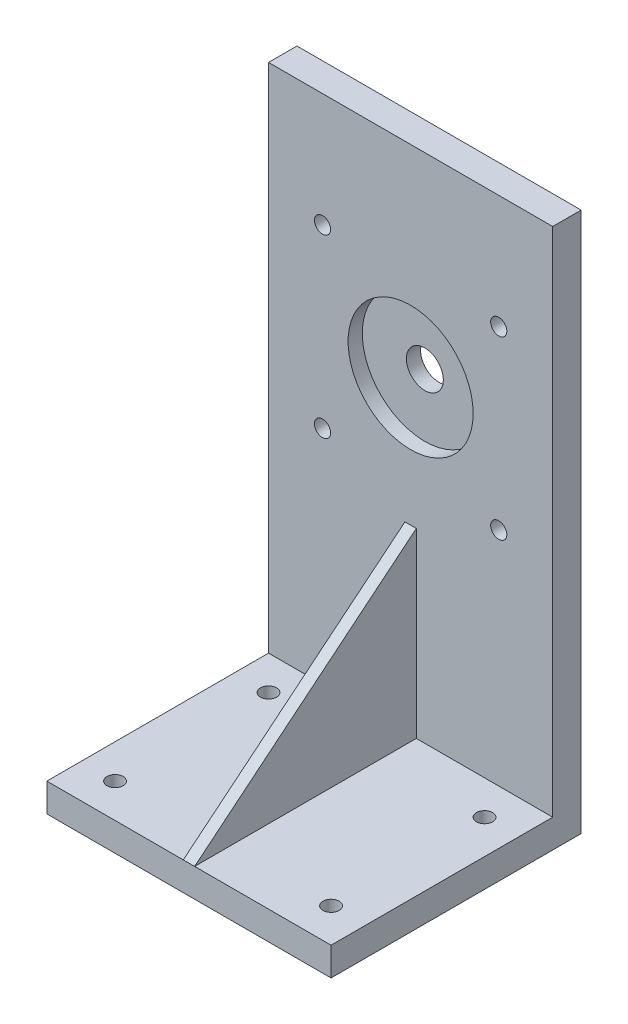
ISO-10303-21;
HEADER;
FILE_DESCRIPTION(('STEP AP214'),'2;1');
FILE_NAME('part.step','',(''),(''),'','','');
FILE_SCHEMA(('AUTOMOTIVE_DESIGN { 1 0 10303 214 1 1 1 1 }'));
ENDSEC;
DATA;
#1=APPLICATION_CONTEXT('core data for automotive mechanical design processes');
#2=APPLICATION_PROTOCOL_DEFINITION('international standard','automotive_design',2000,#1);
#3=PRODUCT_CONTEXT('',#1,'mechanical');
#4=PRODUCT('Part','Part','',(#3));
#5=PRODUCT_RELATED_PRODUCT_CATEGORY('part','',(#4));
#6=PRODUCT_DEFINITION_FORMATION('','',#4);
#7=PRODUCT_DEFINITION_CONTEXT('part definition',#1,'design');
#8=PRODUCT_DEFINITION('design','',#6,#7);
#9=PRODUCT_DEFINITION_SHAPE('','',#8);
#10=(LENGTH_UNIT() NAMED_UNIT(*) SI_UNIT(.MILLI.,.METRE.));
#11=(NAMED_UNIT(*) PLANE_ANGLE_UNIT() SI_UNIT($,.RADIAN.));
#12=(NAMED_UNIT(*) SI_UNIT($,.STERADIAN.) SOLID_ANGLE_UNIT());
#13=UNCERTAINTY_MEASURE_WITH_UNIT(LENGTH_MEASURE(1.E-05),#10,'distance_accuracy_value','');
#14=(GEOMETRIC_REPRESENTATION_CONTEXT(3) GLOBAL_UNCERTAINTY_ASSIGNED_CONTEXT((#13)) GLOBAL_UNIT_ASSIGNED_CONTEXT((#10,
#11,#12)) REPRESENTATION_CONTEXT('',''));
#15=CARTESIAN_POINT('',(0.,0.,0.));
#16=DIRECTION('',(0.,0.,1.));
#17=DIRECTION('',(1.,0.,0.));
#18=AXIS2_PLACEMENT_3D('',#15,#16,#17);
#19=CARTESIAN_POINT('',(0.,5.,0.));
#20=DIRECTION('',(0.,-1.,0.));
#21=DIRECTION('',(0.,0.,-1.));
#22=AXIS2_PLACEMENT_3D('',#19,#20,#21);
#23=PLANE('',#22);
#24=CARTESIAN_POINT('',(19.,5.,-11.));
#25=DIRECTION('',(0.,1.,0.));
#26=DIRECTION('',(0.,0.,1.));
#27=AXIS2_PLACEMENT_3D('',#24,#25,#26);
#28=CIRCLE('',#27,1.42);
#29=CARTESIAN_POINT('',(19.,5.,-9.57999999999999));
#30=VERTEX_POINT('',#29);
#31=EDGE_CURVE('E176',#30,#30,#28,.T.);
#32=ORIENTED_EDGE('',*,*,#31,.F.);
#33=EDGE_LOOP('',(#32));
#34=FACE_BOUND('',#33,.T.);
#35=CARTESIAN_POINT('',(19.,5.,16.));
#36=DIRECTION('',(0.,1.,0.));
#37=DIRECTION('',(0.,0.,1.));
#38=AXIS2_PLACEMENT_3D('',#35,#36,#37);
#39=CIRCLE('',#38,1.42);
#40=CARTESIAN_POINT('',(19.,5.,17.42));
#41=VERTEX_POINT('',#40);
#42=EDGE_CURVE('E260',#41,#41,#39,.T.);
#43=ORIENTED_EDGE('',*,*,#42,.F.);
#44=EDGE_LOOP('',(#43));
#45=FACE_BOUND('',#44,.T.);
#46=DIRECTION('',(0.,0.,-1.));
#47=VECTOR('',#46,1.);
#48=CARTESIAN_POINT('',(0.999999999999997,5.,-17.));
#49=LINE('',#48,#47);
#50=CARTESIAN_POINT('',(1.,5.,22.));
#51=VERTEX_POINT('',#50);
#52=CARTESIAN_POINT('',(1.,5.,-17.));
#53=VERTEX_POINT('',#52);
#54=EDGE_CURVE('E119',#51,#53,#49,.T.);
#55=ORIENTED_EDGE('',*,*,#54,.F.);
#56=DIRECTION('',(1.,0.,0.));
#57=VECTOR('',#56,1.);
#58=CARTESIAN_POINT('',(-25.,5.,22.));
#59=LINE('',#58,#57);
#60=CARTESIAN_POINT('',(25.,5.,22.));
#61=VERTEX_POINT('',#60);
#62=EDGE_CURVE('E123',#51,#61,#59,.T.);
#63=ORIENTED_EDGE('',*,*,#62,.T.);
#64=DIRECTION('',(0.,0.,-1.));
#65=VECTOR('',#64,1.);
#66=CARTESIAN_POINT('',(25.,5.,22.));
#67=LINE('',#66,#65);
#68=CARTESIAN_POINT('',(25.,5.,-17.));
#69=VERTEX_POINT('',#68);
#70=EDGE_CURVE('E135',#61,#69,#67,.T.);
#71=ORIENTED_EDGE('',*,*,#70,.T.);
#72=DIRECTION('',(1.,0.,0.));
#73=VECTOR('',#72,1.);
#74=CARTESIAN_POINT('',(-25.,5.,-17.));
#75=LINE('',#74,#73);
#76=EDGE_CURVE('E125',#53,#69,#75,.T.);
#77=ORIENTED_EDGE('',*,*,#76,.F.);
#78=EDGE_LOOP('',(#55,#63,#71,#77));
#79=FACE_BOUND('',#78,.T.);
#80=ADVANCED_FACE('F35',(#34,#45,#79),#23,.F.);
#81=CARTESIAN_POINT('',(-19.,5.,-11.));
#82=DIRECTION('',(0.,1.,0.));
#83=DIRECTION('',(0.,0.,1.));
#84=AXIS2_PLACEMENT_3D('',#81,#82,#83);
#85=CIRCLE('',#84,1.42);
#86=CARTESIAN_POINT('',(-19.,5.,-9.57999999999999));
#87=VERTEX_POINT('',#86);
#88=EDGE_CURVE('E159',#87,#87,#85,.T.);
#89=ORIENTED_EDGE('',*,*,#88,.F.);
#90=EDGE_LOOP('',(#89));
#91=FACE_BOUND('',#90,.T.);
#92=CARTESIAN_POINT('',(-19.,5.,16.));
#93=DIRECTION('',(0.,1.,0.));
#94=DIRECTION('',(0.,0.,1.));
#95=AXIS2_PLACEMENT_3D('',#92,#93,#94);
#96=CIRCLE('',#95,1.42);
#97=CARTESIAN_POINT('',(-19.,5.,17.42));
#98=VERTEX_POINT('',#97);
#99=EDGE_CURVE('E163',#98,#98,#96,.T.);
#100=ORIENTED_EDGE('',*,*,#99,.F.);
#101=EDGE_LOOP('',(#100));
#102=FACE_BOUND('',#101,.T.);
#103=DIRECTION('',(0.,0.,1.));
#104=VECTOR('',#103,1.);
#105=CARTESIAN_POINT('',(-0.999999999999997,5.,-17.));
#106=LINE('',#105,#104);
#107=CARTESIAN_POINT('',(-0.999999999999994,5.,-17.));
#108=VERTEX_POINT('',#107);
#109=CARTESIAN_POINT('',(-0.999999999999994,5.,22.));
#110=VERTEX_POINT('',#109);
#111=EDGE_CURVE('E126',#108,#110,#106,.T.);
#112=ORIENTED_EDGE('',*,*,#111,.F.);
#113=CARTESIAN_POINT('',(-25.,5.,-17.));
#114=VERTEX_POINT('',#113);
#115=EDGE_CURVE('E217',#114,#108,#75,.T.);
#116=ORIENTED_EDGE('',*,*,#115,.F.);
#117=DIRECTION('',(0.,0.,1.));
#118=VECTOR('',#117,1.);
#119=CARTESIAN_POINT('',(-25.,5.,22.));
#120=LINE('',#119,#118);
#121=CARTESIAN_POINT('',(-25.,5.,22.));
#122=VERTEX_POINT('',#121);
#123=EDGE_CURVE('E133',#114,#122,#120,.T.);
#124=ORIENTED_EDGE('',*,*,#123,.T.);
#125=EDGE_CURVE('E132',#122,#110,#59,.T.);
#126=ORIENTED_EDGE('',*,*,#125,.T.);
#127=EDGE_LOOP('',(#112,#116,#124,#126));
#128=FACE_BOUND('',#127,.T.);
#129=ADVANCED_FACE('F247',(#91,#102,#128),#23,.F.);
#130=CARTESIAN_POINT('',(-25.,95.,-17.));
#131=DIRECTION('',(0.,0.,-1.));
#132=DIRECTION('',(-1.,0.,0.));
#133=AXIS2_PLACEMENT_3D('',#130,#131,#132);
#134=PLANE('',#133);
#135=DIRECTION('',(0.,-1.,0.));
#136=VECTOR('',#135,1.);
#137=CARTESIAN_POINT('',(-0.999999999999997,37.,-17.));
#138=LINE('',#137,#136);
#139=CARTESIAN_POINT('',(-0.999999999999994,37.,-17.));
#140=VERTEX_POINT('',#139);
#141=EDGE_CURVE('E250',#140,#108,#138,.T.);
#142=ORIENTED_EDGE('',*,*,#141,.F.);
#143=DIRECTION('',(-1.,0.,0.));
#144=VECTOR('',#143,1.);
#145=CARTESIAN_POINT('',(0.999999999999997,37.,-17.));
#146=LINE('',#145,#144);
#147=CARTESIAN_POINT('',(1.,37.,-17.));
#148=VERTEX_POINT('',#147);
#149=EDGE_CURVE('E253',#148,#140,#146,.T.);
#150=ORIENTED_EDGE('',*,*,#149,.F.);
#151=DIRECTION('',(0.,-1.,0.));
#152=VECTOR('',#151,1.);
#153=CARTESIAN_POINT('',(0.999999999999997,37.,-17.));
#154=LINE('',#153,#152);
#155=EDGE_CURVE('E59',#148,#53,#154,.T.);
#156=ORIENTED_EDGE('',*,*,#155,.T.);
#157=ORIENTED_EDGE('',*,*,#76,.T.);
#158=DIRECTION('',(0.,-1.,0.));
#159=VECTOR('',#158,1.);
#160=CARTESIAN_POINT('',(25.,95.,-17.));
#161=LINE('',#160,#159);
#162=CARTESIAN_POINT('',(25.,95.,-17.));
#163=VERTEX_POINT('',#162);
#164=EDGE_CURVE('E225',#163,#69,#161,.T.);
#165=ORIENTED_EDGE('',*,*,#164,.F.);
#166=DIRECTION('',(1.,0.,0.));
#167=VECTOR('',#166,1.);
#168=CARTESIAN_POINT('',(-25.,95.,-17.));
#169=LINE('',#168,#167);
#170=CARTESIAN_POINT('',(-25.,95.,-17.));
#171=VERTEX_POINT('',#170);
#172=EDGE_CURVE('E216',#171,#163,#169,.T.);
#173=ORIENTED_EDGE('',*,*,#172,.F.);
#174=DIRECTION('',(0.,-1.,0.));
#175=VECTOR('',#174,1.);
#176=CARTESIAN_POINT('',(-25.,95.,-17.));
#177=LINE('',#176,#175);
#178=EDGE_CURVE('E143',#171,#114,#177,.T.);
#179=ORIENTED_EDGE('',*,*,#178,.T.);
#180=ORIENTED_EDGE('',*,*,#115,.T.);
#181=EDGE_LOOP('',(#142,#150,#156,#157,#165,#173,#179,#180));
#182=FACE_BOUND('',#181,.T.);
#183=CARTESIAN_POINT('',(0.,59.5,-17.));
#184=DIRECTION('',(0.,0.,1.));
#185=DIRECTION('',(1.,0.,0.));
#186=AXIS2_PLACEMENT_3D('',#183,#184,#185);
#187=CIRCLE('',#186,11.);
#188=CARTESIAN_POINT('',(11.,59.5,-17.));
#189=VERTEX_POINT('',#188);
#190=EDGE_CURVE('E183',#189,#189,#187,.T.);
#191=ORIENTED_EDGE('',*,*,#190,.F.);
#192=EDGE_LOOP('',(#191));
#193=FACE_BOUND('',#192,.T.);
#194=CARTESIAN_POINT('',(15.5,44.,-17.));
#195=DIRECTION('',(0.,0.,1.));
#196=DIRECTION('',(1.,0.,0.));
#197=AXIS2_PLACEMENT_3D('',#194,#195,#196);
#198=CIRCLE('',#197,1.42);
#199=CARTESIAN_POINT('',(16.92,44.,-17.));
#200=VERTEX_POINT('',#199);
#201=EDGE_CURVE('E190',#200,#200,#198,.T.);
#202=ORIENTED_EDGE('',*,*,#201,.F.);
#203=EDGE_LOOP('',(#202));
#204=FACE_BOUND('',#203,.T.);
#205=CARTESIAN_POINT('',(15.4999999999999,75.,-17.));
#206=DIRECTION('',(0.,0.,1.));
#207=DIRECTION('',(1.,0.,0.));
#208=AXIS2_PLACEMENT_3D('',#205,#206,#207);
#209=CIRCLE('',#208,1.41999999999999);
#210=CARTESIAN_POINT('',(16.9199999999999,75.,-17.));
#211=VERTEX_POINT('',#210);
#212=EDGE_CURVE('E194',#211,#211,#209,.T.);
#213=ORIENTED_EDGE('',*,*,#212,.F.);
#214=EDGE_LOOP('',(#213));
#215=FACE_BOUND('',#214,.T.);
#216=CARTESIAN_POINT('',(-15.5000000000001,75.,-17.));
#217=DIRECTION('',(0.,0.,1.));
#218=DIRECTION('',(1.,0.,0.));
#219=AXIS2_PLACEMENT_3D('',#216,#217,#218);
#220=CIRCLE('',#219,1.42);
#221=CARTESIAN_POINT('',(-14.0800000000001,75.,-17.));
#222=VERTEX_POINT('',#221);
#223=EDGE_CURVE('E187',#222,#222,#220,.T.);
#224=ORIENTED_EDGE('',*,*,#223,.F.);
#225=EDGE_LOOP('',(#224));
#226=FACE_BOUND('',#225,.T.);
#227=CARTESIAN_POINT('',(-15.5,44.,-17.));
#228=DIRECTION('',(0.,0.,1.));
#229=DIRECTION('',(1.,0.,0.));
#230=AXIS2_PLACEMENT_3D('',#227,#228,#229);
#231=CIRCLE('',#230,1.42);
#232=CARTESIAN_POINT('',(-14.08,44.,-17.));
#233=VERTEX_POINT('',#232);
#234=EDGE_CURVE('E207',#233,#233,#231,.T.);
#235=ORIENTED_EDGE('',*,*,#234,.F.);
#236=EDGE_LOOP('',(#235));
#237=FACE_BOUND('',#236,.T.);
#238=ADVANCED_FACE('F234',(#182,#193,#204,#215,#226,#237),#134,.F.);
#239=CARTESIAN_POINT('',(25.,5.,22.));
#240=DIRECTION('',(-1.,0.,0.));
#241=DIRECTION('',(0.,0.,1.));
#242=AXIS2_PLACEMENT_3D('',#239,#240,#241);
#243=PLANE('',#242);
#244=DIRECTION('',(0.,0.,-1.));
#245=VECTOR('',#244,1.);
#246=CARTESIAN_POINT('',(25.,0.,22.));
#247=LINE('',#246,#245);
#248=CARTESIAN_POINT('',(25.,0.,22.));
#249=VERTEX_POINT('',#248);
#250=CARTESIAN_POINT('',(25.,0.,-22.));
#251=VERTEX_POINT('',#250);
#252=EDGE_CURVE('E139',#249,#251,#247,.T.);
#253=ORIENTED_EDGE('',*,*,#252,.T.);
#254=DIRECTION('',(0.,-1.,0.));
#255=VECTOR('',#254,1.);
#256=CARTESIAN_POINT('',(25.,5.,-22.));
#257=LINE('',#256,#255);
#258=CARTESIAN_POINT('',(25.,95.,-22.));
#259=VERTEX_POINT('',#258);
#260=EDGE_CURVE('E11',#259,#251,#257,.T.);
#261=ORIENTED_EDGE('',*,*,#260,.F.);
#262=DIRECTION('',(0.,0.,-1.));
#263=VECTOR('',#262,1.);
#264=CARTESIAN_POINT('',(25.,95.,-22.));
#265=LINE('',#264,#263);
#266=EDGE_CURVE('E219',#163,#259,#265,.T.);
#267=ORIENTED_EDGE('',*,*,#266,.F.);
#268=ORIENTED_EDGE('',*,*,#164,.T.);
#269=ORIENTED_EDGE('',*,*,#70,.F.);
#270=DIRECTION('',(0.,-1.,0.));
#271=VECTOR('',#270,1.);
#272=CARTESIAN_POINT('',(25.,5.,22.));
#273=LINE('',#272,#271);
#274=EDGE_CURVE('E130',#61,#249,#273,.T.);
#275=ORIENTED_EDGE('',*,*,#274,.T.);
#276=EDGE_LOOP('',(#253,#261,#267,#268,#269,#275));
#277=FACE_BOUND('',#276,.T.);
#278=ADVANCED_FACE('F37',(#277),#243,.F.);
#279=CARTESIAN_POINT('',(-25.,5.,-22.));
#280=DIRECTION('',(0.,0.,1.));
#281=DIRECTION('',(1.,0.,0.));
#282=AXIS2_PLACEMENT_3D('',#279,#280,#281);
#283=PLANE('',#282);
#284=CARTESIAN_POINT('',(0.,59.5,-22.));
#285=DIRECTION('',(0.,0.,1.));
#286=DIRECTION('',(1.,0.,0.));
#287=AXIS2_PLACEMENT_3D('',#284,#285,#286);
#288=CIRCLE('',#287,3.25);
#289=CARTESIAN_POINT('',(3.25,59.5,-22.));
#290=VERTEX_POINT('',#289);
#291=EDGE_CURVE('E180',#290,#290,#288,.T.);
#292=ORIENTED_EDGE('',*,*,#291,.T.);
#293=EDGE_LOOP('',(#292));
#294=FACE_BOUND('',#293,.T.);
#295=CARTESIAN_POINT('',(15.5,44.,-22.));
#296=DIRECTION('',(0.,0.,1.));
#297=DIRECTION('',(1.,0.,0.));
#298=AXIS2_PLACEMENT_3D('',#295,#296,#297);
#299=CIRCLE('',#298,1.42);
#300=CARTESIAN_POINT('',(16.92,44.,-22.));
#301=VERTEX_POINT('',#300);
#302=EDGE_CURVE('E204',#301,#301,#299,.T.);
#303=ORIENTED_EDGE('',*,*,#302,.T.);
#304=EDGE_LOOP('',(#303));
#305=FACE_BOUND('',#304,.T.);
#306=CARTESIAN_POINT('',(15.4999999999999,75.,-22.));
#307=DIRECTION('',(0.,0.,1.));
#308=DIRECTION('',(1.,0.,0.));
#309=AXIS2_PLACEMENT_3D('',#306,#307,#308);
#310=CIRCLE('',#309,1.41999999999999);
#311=CARTESIAN_POINT('',(16.9199999999999,75.,-22.));
#312=VERTEX_POINT('',#311);
#313=EDGE_CURVE('E201',#312,#312,#310,.T.);
#314=ORIENTED_EDGE('',*,*,#313,.T.);
#315=EDGE_LOOP('',(#314));
#316=FACE_BOUND('',#315,.T.);
#317=CARTESIAN_POINT('',(-15.5000000000001,75.,-22.));
#318=DIRECTION('',(0.,0.,1.));
#319=DIRECTION('',(1.,0.,0.));
#320=AXIS2_PLACEMENT_3D('',#317,#318,#319);
#321=CIRCLE('',#320,1.42);
#322=CARTESIAN_POINT('',(-14.0800000000001,75.,-22.));
#323=VERTEX_POINT('',#322);
#324=EDGE_CURVE('E193',#323,#323,#321,.T.);
#325=ORIENTED_EDGE('',*,*,#324,.T.);
#326=EDGE_LOOP('',(#325));
#327=FACE_BOUND('',#326,.T.);
#328=CARTESIAN_POINT('',(-15.5,44.,-22.));
#329=DIRECTION('',(0.,0.,1.));
#330=DIRECTION('',(1.,0.,0.));
#331=AXIS2_PLACEMENT_3D('',#328,#329,#330);
#332=CIRCLE('',#331,1.42);
#333=CARTESIAN_POINT('',(-14.08,44.,-22.));
#334=VERTEX_POINT('',#333);
#335=EDGE_CURVE('E210',#334,#334,#332,.T.);
#336=ORIENTED_EDGE('',*,*,#335,.T.);
#337=EDGE_LOOP('',(#336));
#338=FACE_BOUND('',#337,.T.);
#339=DIRECTION('',(-1.,0.,0.));
#340=VECTOR('',#339,1.);
#341=CARTESIAN_POINT('',(-25.,0.,-22.));
#342=LINE('',#341,#340);
#343=CARTESIAN_POINT('',(-25.,0.,-22.));
#344=VERTEX_POINT('',#343);
#345=EDGE_CURVE('E142',#251,#344,#342,.T.);
#346=ORIENTED_EDGE('',*,*,#345,.T.);
#347=DIRECTION('',(0.,-1.,0.));
#348=VECTOR('',#347,1.);
#349=CARTESIAN_POINT('',(-25.,5.,-22.));
#350=LINE('',#349,#348);
#351=CARTESIAN_POINT('',(-25.,95.,-22.));
#352=VERTEX_POINT('',#351);
#353=EDGE_CURVE('E44',#352,#344,#350,.T.);
#354=ORIENTED_EDGE('',*,*,#353,.F.);
#355=DIRECTION('',(-1.,0.,0.));
#356=VECTOR('',#355,1.);
#357=CARTESIAN_POINT('',(-25.,95.,-22.));
#358=LINE('',#357,#356);
#359=EDGE_CURVE('E222',#259,#352,#358,.T.);
#360=ORIENTED_EDGE('',*,*,#359,.F.);
#361=ORIENTED_EDGE('',*,*,#260,.T.);
#362=EDGE_LOOP('',(#346,#354,#360,#361));
#363=FACE_BOUND('',#362,.T.);
#364=ADVANCED_FACE('F286',(#294,#305,#316,#327,#338,#363),#283,.F.);
#365=CARTESIAN_POINT('',(-25.,5.,22.));
#366=DIRECTION('',(1.,0.,0.));
#367=DIRECTION('',(0.,0.,-1.));
#368=AXIS2_PLACEMENT_3D('',#365,#366,#367);
#369=PLANE('',#368);
#370=DIRECTION('',(0.,0.,1.));
#371=VECTOR('',#370,1.);
#372=CARTESIAN_POINT('',(-25.,0.,22.));
#373=LINE('',#372,#371);
#374=CARTESIAN_POINT('',(-25.,0.,22.));
#375=VERTEX_POINT('',#374);
#376=EDGE_CURVE('E145',#344,#375,#373,.T.);
#377=ORIENTED_EDGE('',*,*,#376,.T.);
#378=DIRECTION('',(0.,-1.,0.));
#379=VECTOR('',#378,1.);
#380=CARTESIAN_POINT('',(-25.,5.,22.));
#381=LINE('',#380,#379);
#382=EDGE_CURVE('E150',#122,#375,#381,.T.);
#383=ORIENTED_EDGE('',*,*,#382,.F.);
#384=ORIENTED_EDGE('',*,*,#123,.F.);
#385=ORIENTED_EDGE('',*,*,#178,.F.);
#386=DIRECTION('',(0.,0.,1.));
#387=VECTOR('',#386,1.);
#388=CARTESIAN_POINT('',(-25.,95.,-22.));
#389=LINE('',#388,#387);
#390=EDGE_CURVE('E213',#352,#171,#389,.T.);
#391=ORIENTED_EDGE('',*,*,#390,.F.);
#392=ORIENTED_EDGE('',*,*,#353,.T.);
#393=EDGE_LOOP('',(#377,#383,#384,#385,#391,#392));
#394=FACE_BOUND('',#393,.T.);
#395=ADVANCED_FACE('F244',(#394),#369,.F.);
#396=CARTESIAN_POINT('',(-25.,5.,22.));
#397=DIRECTION('',(0.,0.,-1.));
#398=DIRECTION('',(-1.,0.,0.));
#399=AXIS2_PLACEMENT_3D('',#396,#397,#398);
#400=PLANE('',#399);
#401=ORIENTED_EDGE('',*,*,#62,.F.);
#402=DIRECTION('',(1.,0.,0.));
#403=VECTOR('',#402,1.);
#404=CARTESIAN_POINT('',(-34.,5.,22.));
#405=LINE('',#404,#403);
#406=EDGE_CURVE('E106',#110,#51,#405,.T.);
#407=ORIENTED_EDGE('',*,*,#406,.F.);
#408=ORIENTED_EDGE('',*,*,#125,.F.);
#409=ORIENTED_EDGE('',*,*,#382,.T.);
#410=DIRECTION('',(1.,0.,0.));
#411=VECTOR('',#410,1.);
#412=CARTESIAN_POINT('',(-25.,0.,22.));
#413=LINE('',#412,#411);
#414=EDGE_CURVE('E147',#375,#249,#413,.T.);
#415=ORIENTED_EDGE('',*,*,#414,.T.);
#416=ORIENTED_EDGE('',*,*,#274,.F.);
#417=EDGE_LOOP('',(#401,#407,#408,#409,#415,#416));
#418=FACE_BOUND('',#417,.T.);
#419=ADVANCED_FACE('F128',(#418),#400,.F.);
#420=CARTESIAN_POINT('',(0.,0.,0.));
#421=DIRECTION('',(0.,-1.,0.));
#422=DIRECTION('',(0.,0.,-1.));
#423=AXIS2_PLACEMENT_3D('',#420,#421,#422);
#424=PLANE('',#423);
#425=CARTESIAN_POINT('',(-19.,0.,16.));
#426=DIRECTION('',(0.,-1.,0.));
#427=DIRECTION('',(0.,0.,-1.));
#428=AXIS2_PLACEMENT_3D('',#425,#426,#427);
#429=CIRCLE('',#428,1.42);
#430=CARTESIAN_POINT('',(-19.,0.,14.58));
#431=VERTEX_POINT('',#430);
#432=EDGE_CURVE('E39',#431,#431,#429,.T.);
#433=ORIENTED_EDGE('',*,*,#432,.F.);
#434=EDGE_LOOP('',(#433));
#435=FACE_BOUND('',#434,.T.);
#436=CARTESIAN_POINT('',(19.,0.,16.));
#437=DIRECTION('',(0.,-1.,0.));
#438=DIRECTION('',(0.,0.,-1.));
#439=AXIS2_PLACEMENT_3D('',#436,#437,#438);
#440=CIRCLE('',#439,1.42);
#441=CARTESIAN_POINT('',(19.,0.,14.58));
#442=VERTEX_POINT('',#441);
#443=EDGE_CURVE('E162',#442,#442,#440,.T.);
#444=ORIENTED_EDGE('',*,*,#443,.F.);
#445=EDGE_LOOP('',(#444));
#446=FACE_BOUND('',#445,.T.);
#447=CARTESIAN_POINT('',(19.,0.,-11.));
#448=DIRECTION('',(0.,-1.,0.));
#449=DIRECTION('',(0.,0.,-1.));
#450=AXIS2_PLACEMENT_3D('',#447,#448,#449);
#451=CIRCLE('',#450,1.42);
#452=CARTESIAN_POINT('',(19.,0.,-12.42));
#453=VERTEX_POINT('',#452);
#454=EDGE_CURVE('E160',#453,#453,#451,.T.);
#455=ORIENTED_EDGE('',*,*,#454,.F.);
#456=EDGE_LOOP('',(#455));
#457=FACE_BOUND('',#456,.T.);
#458=CARTESIAN_POINT('',(-19.,0.,-11.));
#459=DIRECTION('',(0.,-1.,0.));
#460=DIRECTION('',(0.,0.,-1.));
#461=AXIS2_PLACEMENT_3D('',#458,#459,#460);
#462=CIRCLE('',#461,1.42);
#463=CARTESIAN_POINT('',(-19.,0.,-12.42));
#464=VERTEX_POINT('',#463);
#465=EDGE_CURVE('E155',#464,#464,#462,.T.);
#466=ORIENTED_EDGE('',*,*,#465,.F.);
#467=EDGE_LOOP('',(#466));
#468=FACE_BOUND('',#467,.T.);
#469=ORIENTED_EDGE('',*,*,#252,.F.);
#470=ORIENTED_EDGE('',*,*,#414,.F.);
#471=ORIENTED_EDGE('',*,*,#376,.F.);
#472=ORIENTED_EDGE('',*,*,#345,.F.);
#473=EDGE_LOOP('',(#469,#470,#471,#472));
#474=FACE_BOUND('',#473,.T.);
#475=ADVANCED_FACE('F279',(#435,#446,#457,#468,#474),#424,.T.);
#476=CARTESIAN_POINT('',(0.,95.,0.));
#477=DIRECTION('',(0.,1.,0.));
#478=DIRECTION('',(0.,0.,1.));
#479=AXIS2_PLACEMENT_3D('',#476,#477,#478);
#480=PLANE('',#479);
#481=ORIENTED_EDGE('',*,*,#390,.T.);
#482=ORIENTED_EDGE('',*,*,#172,.T.);
#483=ORIENTED_EDGE('',*,*,#266,.T.);
#484=ORIENTED_EDGE('',*,*,#359,.T.);
#485=EDGE_LOOP('',(#481,#482,#483,#484));
#486=FACE_BOUND('',#485,.T.);
#487=ADVANCED_FACE('F240',(#486),#480,.T.);
#488=CARTESIAN_POINT('',(-15.5,44.,-77.));
#489=DIRECTION('',(0.,0.,1.));
#490=DIRECTION('',(1.,0.,0.));
#491=AXIS2_PLACEMENT_3D('',#488,#489,#490);
#492=CYLINDRICAL_SURFACE('',#491,1.42);
#493=ORIENTED_EDGE('',*,*,#234,.T.);
#494=EDGE_LOOP('',(#493));
#495=FACE_BOUND('',#494,.T.);
#496=ORIENTED_EDGE('',*,*,#335,.F.);
#497=EDGE_LOOP('',(#496));
#498=FACE_BOUND('',#497,.T.);
#499=ADVANCED_FACE('F307',(#495,#498),#492,.F.);
#500=CARTESIAN_POINT('',(-15.5000000000001,75.,-77.));
#501=DIRECTION('',(0.,0.,1.));
#502=DIRECTION('',(1.,0.,0.));
#503=AXIS2_PLACEMENT_3D('',#500,#501,#502);
#504=CYLINDRICAL_SURFACE('',#503,1.42);
#505=ORIENTED_EDGE('',*,*,#223,.T.);
#506=EDGE_LOOP('',(#505));
#507=FACE_BOUND('',#506,.T.);
#508=ORIENTED_EDGE('',*,*,#324,.F.);
#509=EDGE_LOOP('',(#508));
#510=FACE_BOUND('',#509,.T.);
#511=ADVANCED_FACE('F309',(#507,#510),#504,.F.);
#512=CARTESIAN_POINT('',(15.4999999999999,75.,-77.));
#513=DIRECTION('',(0.,0.,1.));
#514=DIRECTION('',(1.,0.,0.));
#515=AXIS2_PLACEMENT_3D('',#512,#513,#514);
#516=CYLINDRICAL_SURFACE('',#515,1.41999999999999);
#517=ORIENTED_EDGE('',*,*,#212,.T.);
#518=EDGE_LOOP('',(#517));
#519=FACE_BOUND('',#518,.T.);
#520=ORIENTED_EDGE('',*,*,#313,.F.);
#521=EDGE_LOOP('',(#520));
#522=FACE_BOUND('',#521,.T.);
#523=ADVANCED_FACE('F316',(#519,#522),#516,.F.);
#524=CARTESIAN_POINT('',(15.5,44.,-77.));
#525=DIRECTION('',(0.,0.,1.));
#526=DIRECTION('',(1.,0.,0.));
#527=AXIS2_PLACEMENT_3D('',#524,#525,#526);
#528=CYLINDRICAL_SURFACE('',#527,1.42);
#529=ORIENTED_EDGE('',*,*,#201,.T.);
#530=EDGE_LOOP('',(#529));
#531=FACE_BOUND('',#530,.T.);
#532=ORIENTED_EDGE('',*,*,#302,.F.);
#533=EDGE_LOOP('',(#532));
#534=FACE_BOUND('',#533,.T.);
#535=ADVANCED_FACE('F322',(#531,#534),#528,.F.);
#536=CARTESIAN_POINT('',(0.,59.5,-19.5));
#537=DIRECTION('',(0.,0.,1.));
#538=DIRECTION('',(1.,0.,0.));
#539=AXIS2_PLACEMENT_3D('',#536,#537,#538);
#540=CYLINDRICAL_SURFACE('',#539,11.);
#541=CARTESIAN_POINT('',(0.,59.5,-19.5));
#542=DIRECTION('',(0.,0.,1.));
#543=DIRECTION('',(1.,0.,0.));
#544=AXIS2_PLACEMENT_3D('',#541,#542,#543);
#545=CIRCLE('',#544,11.);
#546=CARTESIAN_POINT('',(11.,59.5,-19.5));
#547=VERTEX_POINT('',#546);
#548=EDGE_CURVE('E184',#547,#547,#545,.T.);
#549=ORIENTED_EDGE('',*,*,#548,.F.);
#550=EDGE_LOOP('',(#549));
#551=FACE_BOUND('',#550,.T.);
#552=ORIENTED_EDGE('',*,*,#190,.T.);
#553=EDGE_LOOP('',(#552));
#554=FACE_BOUND('',#553,.T.);
#555=ADVANCED_FACE('F326',(#551,#554),#540,.F.);
#556=CARTESIAN_POINT('',(0.,59.5,-19.5));
#557=DIRECTION('',(0.,0.,1.));
#558=DIRECTION('',(1.,0.,0.));
#559=AXIS2_PLACEMENT_3D('',#556,#557,#558);
#560=PLANE('',#559);
#561=CARTESIAN_POINT('',(0.,59.5,-19.5));
#562=DIRECTION('',(0.,0.,1.));
#563=DIRECTION('',(1.,0.,0.));
#564=AXIS2_PLACEMENT_3D('',#561,#562,#563);
#565=CIRCLE('',#564,3.25);
#566=CARTESIAN_POINT('',(3.25,59.5,-19.5));
#567=VERTEX_POINT('',#566);
#568=EDGE_CURVE('E158',#567,#567,#565,.T.);
#569=ORIENTED_EDGE('',*,*,#568,.F.);
#570=EDGE_LOOP('',(#569));
#571=FACE_BOUND('',#570,.T.);
#572=ORIENTED_EDGE('',*,*,#548,.T.);
#573=EDGE_LOOP('',(#572));
#574=FACE_BOUND('',#573,.T.);
#575=ADVANCED_FACE('F330',(#571,#574),#560,.T.);
#576=CARTESIAN_POINT('',(0.,59.5,-29.5));
#577=DIRECTION('',(0.,0.,1.));
#578=DIRECTION('',(1.,0.,0.));
#579=AXIS2_PLACEMENT_3D('',#576,#577,#578);
#580=CYLINDRICAL_SURFACE('',#579,3.25);
#581=ORIENTED_EDGE('',*,*,#568,.T.);
#582=EDGE_LOOP('',(#581));
#583=FACE_BOUND('',#582,.T.);
#584=ORIENTED_EDGE('',*,*,#291,.F.);
#585=EDGE_LOOP('',(#584));
#586=FACE_BOUND('',#585,.T.);
#587=ADVANCED_FACE('F334',(#583,#586),#580,.F.);
#588=CARTESIAN_POINT('',(-19.,-5.,-11.));
#589=DIRECTION('',(0.,1.,0.));
#590=DIRECTION('',(0.,0.,1.));
#591=AXIS2_PLACEMENT_3D('',#588,#589,#590);
#592=CYLINDRICAL_SURFACE('',#591,1.42);
#593=ORIENTED_EDGE('',*,*,#465,.T.);
#594=EDGE_LOOP('',(#593));
#595=FACE_BOUND('',#594,.T.);
#596=ORIENTED_EDGE('',*,*,#88,.T.);
#597=EDGE_LOOP('',(#596));
#598=FACE_BOUND('',#597,.T.);
#599=ADVANCED_FACE('F338',(#595,#598),#592,.F.);
#600=CARTESIAN_POINT('',(19.,-5.,-11.));
#601=DIRECTION('',(0.,1.,0.));
#602=DIRECTION('',(0.,0.,1.));
#603=AXIS2_PLACEMENT_3D('',#600,#601,#602);
#604=CYLINDRICAL_SURFACE('',#603,1.42);
#605=ORIENTED_EDGE('',*,*,#454,.T.);
#606=EDGE_LOOP('',(#605));
#607=FACE_BOUND('',#606,.T.);
#608=ORIENTED_EDGE('',*,*,#31,.T.);
#609=EDGE_LOOP('',(#608));
#610=FACE_BOUND('',#609,.T.);
#611=ADVANCED_FACE('F267',(#607,#610),#604,.F.);
#612=CARTESIAN_POINT('',(19.,-5.,16.));
#613=DIRECTION('',(0.,1.,0.));
#614=DIRECTION('',(0.,0.,1.));
#615=AXIS2_PLACEMENT_3D('',#612,#613,#614);
#616=CYLINDRICAL_SURFACE('',#615,1.42);
#617=ORIENTED_EDGE('',*,*,#443,.T.);
#618=EDGE_LOOP('',(#617));
#619=FACE_BOUND('',#618,.T.);
#620=ORIENTED_EDGE('',*,*,#42,.T.);
#621=EDGE_LOOP('',(#620));
#622=FACE_BOUND('',#621,.T.);
#623=ADVANCED_FACE('F345',(#619,#622),#616,.F.);
#624=CARTESIAN_POINT('',(-19.,-5.,16.));
#625=DIRECTION('',(0.,1.,0.));
#626=DIRECTION('',(0.,0.,1.));
#627=AXIS2_PLACEMENT_3D('',#624,#625,#626);
#628=CYLINDRICAL_SURFACE('',#627,1.42);
#629=ORIENTED_EDGE('',*,*,#432,.T.);
#630=EDGE_LOOP('',(#629));
#631=FACE_BOUND('',#630,.T.);
#632=ORIENTED_EDGE('',*,*,#99,.T.);
#633=EDGE_LOOP('',(#632));
#634=FACE_BOUND('',#633,.T.);
#635=ADVANCED_FACE('F349',(#631,#634),#628,.F.);
#636=CARTESIAN_POINT('',(0.999999999999997,37.,-17.));
#637=DIRECTION('',(-1.,0.,0.));
#638=DIRECTION('',(0.,0.,1.));
#639=AXIS2_PLACEMENT_3D('',#636,#637,#638);
#640=PLANE('',#639);
#641=ORIENTED_EDGE('',*,*,#155,.F.);
#642=DIRECTION('',(0.,0.634316611678023,-0.77307337048259));
#643=VECTOR('',#642,1.);
#644=CARTESIAN_POINT('',(0.999999999999997,37.,-17.));
#645=LINE('',#644,#643);
#646=EDGE_CURVE('E52',#51,#148,#645,.T.);
#647=ORIENTED_EDGE('',*,*,#646,.F.);
#648=ORIENTED_EDGE('',*,*,#54,.T.);
#649=EDGE_LOOP('',(#641,#647,#648));
#650=FACE_BOUND('',#649,.T.);
#651=ADVANCED_FACE('F118',(#650),#640,.F.);
#652=CARTESIAN_POINT('',(-0.999999999999997,37.,-17.));
#653=DIRECTION('',(1.,0.,0.));
#654=DIRECTION('',(0.,0.,-1.));
#655=AXIS2_PLACEMENT_3D('',#652,#653,#654);
#656=PLANE('',#655);
#657=ORIENTED_EDGE('',*,*,#111,.T.);
#658=DIRECTION('',(0.,0.634316611678023,-0.77307337048259));
#659=VECTOR('',#658,1.);
#660=CARTESIAN_POINT('',(-0.999999999999997,37.,-17.));
#661=LINE('',#660,#659);
#662=EDGE_CURVE('E109',#110,#140,#661,.T.);
#663=ORIENTED_EDGE('',*,*,#662,.T.);
#664=ORIENTED_EDGE('',*,*,#141,.T.);
#665=EDGE_LOOP('',(#657,#663,#664));
#666=FACE_BOUND('',#665,.T.);
#667=ADVANCED_FACE('F252',(#666),#656,.F.);
#668=CARTESIAN_POINT('',(-34.,37.,-17.));
#669=DIRECTION('',(0.,-0.77307337048259,-0.634316611678023));
#670=DIRECTION('',(0.,0.634316611678023,-0.77307337048259));
#671=AXIS2_PLACEMENT_3D('',#668,#669,#670);
#672=PLANE('',#671);
#673=ORIENTED_EDGE('',*,*,#406,.T.);
#674=ORIENTED_EDGE('',*,*,#646,.T.);
#675=ORIENTED_EDGE('',*,*,#149,.T.);
#676=ORIENTED_EDGE('',*,*,#662,.F.);
#677=EDGE_LOOP('',(#673,#674,#675,#676));
#678=FACE_BOUND('',#677,.T.);
#679=ADVANCED_FACE('F107',(#678),#672,.F.);
#680=CLOSED_SHELL('',(#80,#129,#238,#278,#364,#395,#419,#475,#487,#499,#511,#523,#535,#555,#575,
#587,#599,#611,#623,#635,#651,#667,#679));
#681=MANIFOLD_SOLID_BREP('B2',#680);
#682=ADVANCED_BREP_SHAPE_REPRESENTATION('',(#18,#681),#14);
#683=SHAPE_DEFINITION_REPRESENTATION(#9,#682);
ENDSEC;
END-ISO-10303-21;
